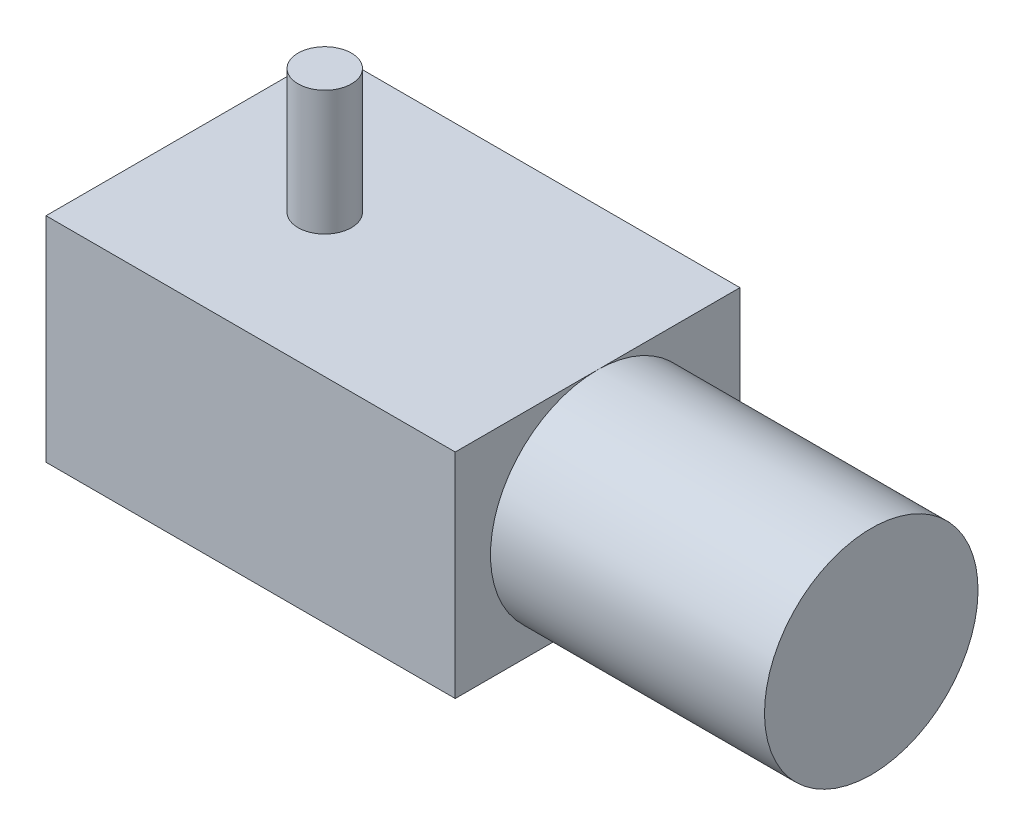
ISO-10303-21;
HEADER;
FILE_DESCRIPTION(('STEP AP214'),'2;1');
FILE_NAME('part.step','',(''),(''),'','','');
FILE_SCHEMA(('AUTOMOTIVE_DESIGN { 1 0 10303 214 1 1 1 1 }'));
ENDSEC;
DATA;
#1=APPLICATION_CONTEXT('core data for automotive mechanical design processes');
#2=APPLICATION_PROTOCOL_DEFINITION('international standard','automotive_design',2000,#1);
#3=PRODUCT_CONTEXT('',#1,'mechanical');
#4=PRODUCT('Part','Part','',(#3));
#5=PRODUCT_RELATED_PRODUCT_CATEGORY('part','',(#4));
#6=PRODUCT_DEFINITION_FORMATION('','',#4);
#7=PRODUCT_DEFINITION_CONTEXT('part definition',#1,'design');
#8=PRODUCT_DEFINITION('design','',#6,#7);
#9=PRODUCT_DEFINITION_SHAPE('','',#8);
#10=(LENGTH_UNIT() NAMED_UNIT(*) SI_UNIT(.MILLI.,.METRE.));
#11=(NAMED_UNIT(*) PLANE_ANGLE_UNIT() SI_UNIT($,.RADIAN.));
#12=(NAMED_UNIT(*) SI_UNIT($,.STERADIAN.) SOLID_ANGLE_UNIT());
#13=UNCERTAINTY_MEASURE_WITH_UNIT(LENGTH_MEASURE(1.E-05),#10,'distance_accuracy_value','');
#14=(GEOMETRIC_REPRESENTATION_CONTEXT(3) GLOBAL_UNCERTAINTY_ASSIGNED_CONTEXT((#13)) GLOBAL_UNIT_ASSIGNED_CONTEXT((#10,
#11,#12)) REPRESENTATION_CONTEXT('',''));
#15=CARTESIAN_POINT('',(0.,0.,0.));
#16=DIRECTION('',(0.,0.,1.));
#17=DIRECTION('',(1.,0.,0.));
#18=AXIS2_PLACEMENT_3D('',#15,#16,#17);
#19=CARTESIAN_POINT('',(0.,24.,0.));
#20=DIRECTION('',(-1.,0.,0.));
#21=DIRECTION('',(0.,0.,1.));
#22=AXIS2_PLACEMENT_3D('',#19,#20,#21);
#23=PLANE('',#22);
#24=DIRECTION('',(0.,0.,-1.));
#25=VECTOR('',#24,1.);
#26=CARTESIAN_POINT('',(0.,0.,0.));
#27=LINE('',#26,#25);
#28=CARTESIAN_POINT('',(0.,0.,-15.826247815899));
#29=VERTEX_POINT('',#28);
#30=CARTESIAN_POINT('',(0.,0.,-16.0949022072));
#31=VERTEX_POINT('',#30);
#32=EDGE_CURVE('E95',#29,#31,#27,.T.);
#33=ORIENTED_EDGE('',*,*,#32,.T.);
#34=CARTESIAN_POINT('',(0.,11.9996240875939,-15.9605750115495));
#35=DIRECTION('',(1.,0.,0.));
#36=DIRECTION('',(0.,0.,-1.));
#37=AXIS2_PLACEMENT_3D('',#34,#35,#36);
#38=CIRCLE('',#37,12.0003759124061);
#39=EDGE_CURVE('E109',#31,#29,#38,.T.);
#40=ORIENTED_EDGE('',*,*,#39,.T.);
#41=EDGE_LOOP('',(#33,#40));
#42=FACE_BOUND('',#41,.T.);
#43=ADVANCED_FACE('F36',(#42),#23,.F.);
#44=CARTESIAN_POINT('',(0.,24.,0.));
#45=DIRECTION('',(0.,1.,0.));
#46=DIRECTION('',(0.,0.,1.));
#47=AXIS2_PLACEMENT_3D('',#44,#45,#46);
#48=PLANE('',#47);
#49=CARTESIAN_POINT('',(-61.4666666666667,24.,-16.));
#50=DIRECTION('',(0.,1.,0.));
#51=DIRECTION('',(0.,0.,1.));
#52=AXIS2_PLACEMENT_3D('',#49,#50,#51);
#53=CIRCLE('',#52,3.);
#54=CARTESIAN_POINT('',(-61.4666666666667,24.,-13.));
#55=VERTEX_POINT('',#54);
#56=EDGE_CURVE('E101',#55,#55,#53,.T.);
#57=ORIENTED_EDGE('',*,*,#56,.F.);
#58=EDGE_LOOP('',(#57));
#59=FACE_BOUND('',#58,.T.);
#60=DIRECTION('',(0.,0.,1.));
#61=VECTOR('',#60,1.);
#62=CARTESIAN_POINT('',(-30.8,24.,0.));
#63=LINE('',#62,#61);
#64=CARTESIAN_POINT('',(-30.8,24.,-15.9605750115495));
#65=VERTEX_POINT('',#64);
#66=CARTESIAN_POINT('',(-30.8,24.,0.));
#67=VERTEX_POINT('',#66);
#68=EDGE_CURVE('E116',#65,#67,#63,.T.);
#69=ORIENTED_EDGE('',*,*,#68,.F.);
#70=DIRECTION('',(0.,0.,1.));
#71=VECTOR('',#70,1.);
#72=CARTESIAN_POINT('',(-30.8,24.,0.));
#73=LINE('',#72,#71);
#74=CARTESIAN_POINT('',(-30.8,24.,-32.));
#75=VERTEX_POINT('',#74);
#76=EDGE_CURVE('E121',#75,#65,#73,.T.);
#77=ORIENTED_EDGE('',*,*,#76,.F.);
#78=DIRECTION('',(-1.,0.,0.));
#79=VECTOR('',#78,1.);
#80=CARTESIAN_POINT('',(0.,24.,-32.));
#81=LINE('',#80,#79);
#82=CARTESIAN_POINT('',(-76.8,24.,-32.));
#83=VERTEX_POINT('',#82);
#84=EDGE_CURVE('E90',#75,#83,#81,.T.);
#85=ORIENTED_EDGE('',*,*,#84,.T.);
#86=DIRECTION('',(0.,0.,1.));
#87=VECTOR('',#86,1.);
#88=CARTESIAN_POINT('',(-76.8,24.,0.));
#89=LINE('',#88,#87);
#90=CARTESIAN_POINT('',(-76.8,24.,0.));
#91=VERTEX_POINT('',#90);
#92=EDGE_CURVE('E59',#83,#91,#89,.T.);
#93=ORIENTED_EDGE('',*,*,#92,.T.);
#94=DIRECTION('',(1.,0.,0.));
#95=VECTOR('',#94,1.);
#96=CARTESIAN_POINT('',(0.,24.,0.));
#97=LINE('',#96,#95);
#98=EDGE_CURVE('E85',#91,#67,#97,.T.);
#99=ORIENTED_EDGE('',*,*,#98,.T.);
#100=EDGE_LOOP('',(#69,#77,#85,#93,#99));
#101=FACE_BOUND('',#100,.T.);
#102=ADVANCED_FACE('F148',(#59,#101),#48,.T.);
#103=CARTESIAN_POINT('',(0.,0.,0.));
#104=DIRECTION('',(0.,1.,0.));
#105=DIRECTION('',(0.,0.,1.));
#106=AXIS2_PLACEMENT_3D('',#103,#104,#105);
#107=PLANE('',#106);
#108=DIRECTION('',(1.,0.,0.));
#109=VECTOR('',#108,1.);
#110=CARTESIAN_POINT('',(-30.8,0.,-16.0949022072));
#111=LINE('',#110,#109);
#112=CARTESIAN_POINT('',(-30.8,0.,-16.0949022072));
#113=VERTEX_POINT('',#112);
#114=EDGE_CURVE('E113',#113,#31,#111,.T.);
#115=ORIENTED_EDGE('',*,*,#114,.T.);
#116=ORIENTED_EDGE('',*,*,#32,.F.);
#117=DIRECTION('',(1.,0.,0.));
#118=VECTOR('',#117,1.);
#119=CARTESIAN_POINT('',(-30.8,0.,-15.826247815899));
#120=LINE('',#119,#118);
#121=CARTESIAN_POINT('',(-30.8,0.,-15.826247815899));
#122=VERTEX_POINT('',#121);
#123=EDGE_CURVE('E104',#122,#29,#120,.T.);
#124=ORIENTED_EDGE('',*,*,#123,.F.);
#125=DIRECTION('',(0.,0.,-1.));
#126=VECTOR('',#125,1.);
#127=CARTESIAN_POINT('',(-30.8,0.,0.));
#128=LINE('',#127,#126);
#129=CARTESIAN_POINT('',(-30.8,0.,0.));
#130=VERTEX_POINT('',#129);
#131=EDGE_CURVE('E89',#130,#122,#128,.T.);
#132=ORIENTED_EDGE('',*,*,#131,.F.);
#133=DIRECTION('',(1.,0.,0.));
#134=VECTOR('',#133,1.);
#135=CARTESIAN_POINT('',(0.,0.,0.));
#136=LINE('',#135,#134);
#137=CARTESIAN_POINT('',(-76.8,0.,0.));
#138=VERTEX_POINT('',#137);
#139=EDGE_CURVE('E79',#138,#130,#136,.T.);
#140=ORIENTED_EDGE('',*,*,#139,.F.);
#141=DIRECTION('',(0.,0.,1.));
#142=VECTOR('',#141,1.);
#143=CARTESIAN_POINT('',(-76.8,0.,0.));
#144=LINE('',#143,#142);
#145=CARTESIAN_POINT('',(-76.8,0.,-32.));
#146=VERTEX_POINT('',#145);
#147=EDGE_CURVE('E71',#146,#138,#144,.T.);
#148=ORIENTED_EDGE('',*,*,#147,.F.);
#149=DIRECTION('',(-1.,0.,0.));
#150=VECTOR('',#149,1.);
#151=CARTESIAN_POINT('',(0.,0.,-32.));
#152=LINE('',#151,#150);
#153=CARTESIAN_POINT('',(-30.8,0.,-32.));
#154=VERTEX_POINT('',#153);
#155=EDGE_CURVE('E80',#154,#146,#152,.T.);
#156=ORIENTED_EDGE('',*,*,#155,.F.);
#157=DIRECTION('',(0.,0.,-1.));
#158=VECTOR('',#157,1.);
#159=CARTESIAN_POINT('',(-30.8,0.,0.));
#160=LINE('',#159,#158);
#161=EDGE_CURVE('E127',#113,#154,#160,.T.);
#162=ORIENTED_EDGE('',*,*,#161,.F.);
#163=EDGE_LOOP('',(#115,#116,#124,#132,#140,#148,#156,#162));
#164=FACE_BOUND('',#163,.T.);
#165=ADVANCED_FACE('F87',(#164),#107,.F.);
#166=CARTESIAN_POINT('',(0.,24.,-32.));
#167=DIRECTION('',(0.,0.,1.));
#168=DIRECTION('',(1.,0.,0.));
#169=AXIS2_PLACEMENT_3D('',#166,#167,#168);
#170=PLANE('',#169);
#171=DIRECTION('',(0.,1.,0.));
#172=VECTOR('',#171,1.);
#173=CARTESIAN_POINT('',(-30.8,0.,-32.));
#174=LINE('',#173,#172);
#175=EDGE_CURVE('E124',#154,#75,#174,.T.);
#176=ORIENTED_EDGE('',*,*,#175,.F.);
#177=ORIENTED_EDGE('',*,*,#155,.T.);
#178=DIRECTION('',(0.,-1.,0.));
#179=VECTOR('',#178,1.);
#180=CARTESIAN_POINT('',(-76.8,24.,-32.));
#181=LINE('',#180,#179);
#182=EDGE_CURVE('E11',#83,#146,#181,.T.);
#183=ORIENTED_EDGE('',*,*,#182,.F.);
#184=ORIENTED_EDGE('',*,*,#84,.F.);
#185=EDGE_LOOP('',(#176,#177,#183,#184));
#186=FACE_BOUND('',#185,.T.);
#187=ADVANCED_FACE('F171',(#186),#170,.F.);
#188=CARTESIAN_POINT('',(0.,24.,0.));
#189=DIRECTION('',(0.,0.,-1.));
#190=DIRECTION('',(-1.,0.,0.));
#191=AXIS2_PLACEMENT_3D('',#188,#189,#190);
#192=PLANE('',#191);
#193=DIRECTION('',(0.,-1.,0.));
#194=VECTOR('',#193,1.);
#195=CARTESIAN_POINT('',(-30.8,0.,0.));
#196=LINE('',#195,#194);
#197=EDGE_CURVE('E50',#67,#130,#196,.T.);
#198=ORIENTED_EDGE('',*,*,#197,.F.);
#199=ORIENTED_EDGE('',*,*,#98,.F.);
#200=DIRECTION('',(0.,-1.,0.));
#201=VECTOR('',#200,1.);
#202=CARTESIAN_POINT('',(-76.8,24.,0.));
#203=LINE('',#202,#201);
#204=EDGE_CURVE('E43',#91,#138,#203,.T.);
#205=ORIENTED_EDGE('',*,*,#204,.T.);
#206=ORIENTED_EDGE('',*,*,#139,.T.);
#207=EDGE_LOOP('',(#198,#199,#205,#206));
#208=FACE_BOUND('',#207,.T.);
#209=ADVANCED_FACE('F84',(#208),#192,.F.);
#210=CARTESIAN_POINT('',(-76.8,24.,0.));
#211=DIRECTION('',(1.,0.,0.));
#212=DIRECTION('',(0.,0.,-1.));
#213=AXIS2_PLACEMENT_3D('',#210,#211,#212);
#214=PLANE('',#213);
#215=ORIENTED_EDGE('',*,*,#147,.T.);
#216=ORIENTED_EDGE('',*,*,#204,.F.);
#217=ORIENTED_EDGE('',*,*,#92,.F.);
#218=ORIENTED_EDGE('',*,*,#182,.T.);
#219=EDGE_LOOP('',(#215,#216,#217,#218));
#220=FACE_BOUND('',#219,.T.);
#221=ADVANCED_FACE('F73',(#220),#214,.F.);
#222=CARTESIAN_POINT('',(-61.4666666666667,38.,-16.));
#223=DIRECTION('',(0.,-1.,0.));
#224=DIRECTION('',(0.,0.,-1.));
#225=AXIS2_PLACEMENT_3D('',#222,#223,#224);
#226=CYLINDRICAL_SURFACE('',#225,3.);
#227=CARTESIAN_POINT('',(-61.4666666666667,38.,-16.));
#228=DIRECTION('',(0.,1.,0.));
#229=DIRECTION('',(0.,0.,1.));
#230=AXIS2_PLACEMENT_3D('',#227,#228,#229);
#231=CIRCLE('',#230,3.);
#232=CARTESIAN_POINT('',(-61.4666666666667,38.,-13.));
#233=VERTEX_POINT('',#232);
#234=EDGE_CURVE('E98',#233,#233,#231,.T.);
#235=ORIENTED_EDGE('',*,*,#234,.F.);
#236=EDGE_LOOP('',(#235));
#237=FACE_BOUND('',#236,.T.);
#238=ORIENTED_EDGE('',*,*,#56,.T.);
#239=EDGE_LOOP('',(#238));
#240=FACE_BOUND('',#239,.T.);
#241=ADVANCED_FACE('F175',(#237,#240),#226,.T.);
#242=CARTESIAN_POINT('',(-61.4666666666667,38.,-16.));
#243=DIRECTION('',(0.,1.,0.));
#244=DIRECTION('',(0.,0.,1.));
#245=AXIS2_PLACEMENT_3D('',#242,#243,#244);
#246=PLANE('',#245);
#247=ORIENTED_EDGE('',*,*,#234,.T.);
#248=EDGE_LOOP('',(#247));
#249=FACE_BOUND('',#248,.T.);
#250=ADVANCED_FACE('F202',(#249),#246,.T.);
#251=CARTESIAN_POINT('',(-30.8,11.9996240875939,-15.9605750115495));
#252=DIRECTION('',(1.,0.,0.));
#253=DIRECTION('',(0.,0.,-1.));
#254=AXIS2_PLACEMENT_3D('',#251,#252,#253);
#255=CYLINDRICAL_SURFACE('',#254,12.0003759124061);
#256=ORIENTED_EDGE('',*,*,#39,.F.);
#257=ORIENTED_EDGE('',*,*,#114,.F.);
#258=CARTESIAN_POINT('',(-30.8,11.9996240875939,-15.9605750115495));
#259=DIRECTION('',(1.,0.,0.));
#260=DIRECTION('',(0.,0.,-1.));
#261=AXIS2_PLACEMENT_3D('',#258,#259,#260);
#262=CIRCLE('',#261,12.0003759124061);
#263=EDGE_CURVE('E130',#113,#65,#262,.T.);
#264=ORIENTED_EDGE('',*,*,#263,.T.);
#265=CARTESIAN_POINT('',(-30.8,11.9996240875939,-15.9605750115495));
#266=DIRECTION('',(1.,0.,0.));
#267=DIRECTION('',(0.,0.,-1.));
#268=AXIS2_PLACEMENT_3D('',#265,#266,#267);
#269=CIRCLE('',#268,12.0003759124061);
#270=EDGE_CURVE('E112',#65,#122,#269,.T.);
#271=ORIENTED_EDGE('',*,*,#270,.T.);
#272=ORIENTED_EDGE('',*,*,#123,.T.);
#273=EDGE_LOOP('',(#256,#257,#264,#271,#272));
#274=FACE_BOUND('',#273,.T.);
#275=ADVANCED_FACE('F138',(#274),#255,.T.);
#276=CARTESIAN_POINT('',(-30.8,0.,0.));
#277=DIRECTION('',(1.,0.,0.));
#278=DIRECTION('',(0.,0.,-1.));
#279=AXIS2_PLACEMENT_3D('',#276,#277,#278);
#280=PLANE('',#279);
#281=ORIENTED_EDGE('',*,*,#270,.F.);
#282=ORIENTED_EDGE('',*,*,#68,.T.);
#283=ORIENTED_EDGE('',*,*,#197,.T.);
#284=ORIENTED_EDGE('',*,*,#131,.T.);
#285=EDGE_LOOP('',(#281,#282,#283,#284));
#286=FACE_BOUND('',#285,.T.);
#287=ADVANCED_FACE('F146',(#286),#280,.T.);
#288=CARTESIAN_POINT('',(-30.8,0.,0.));
#289=DIRECTION('',(1.,0.,0.));
#290=DIRECTION('',(0.,0.,-1.));
#291=AXIS2_PLACEMENT_3D('',#288,#289,#290);
#292=PLANE('',#291);
#293=ORIENTED_EDGE('',*,*,#263,.F.);
#294=ORIENTED_EDGE('',*,*,#161,.T.);
#295=ORIENTED_EDGE('',*,*,#175,.T.);
#296=ORIENTED_EDGE('',*,*,#76,.T.);
#297=EDGE_LOOP('',(#293,#294,#295,#296));
#298=FACE_BOUND('',#297,.T.);
#299=ADVANCED_FACE('F220',(#298),#292,.T.);
#300=CLOSED_SHELL('',(#43,#102,#165,#187,#209,#221,#241,#250,#275,#287,#299));
#301=MANIFOLD_SOLID_BREP('B2',#300);
#302=ADVANCED_BREP_SHAPE_REPRESENTATION('',(#18,#301),#14);
#303=SHAPE_DEFINITION_REPRESENTATION(#9,#302);
ENDSEC;
END-ISO-10303-21;
